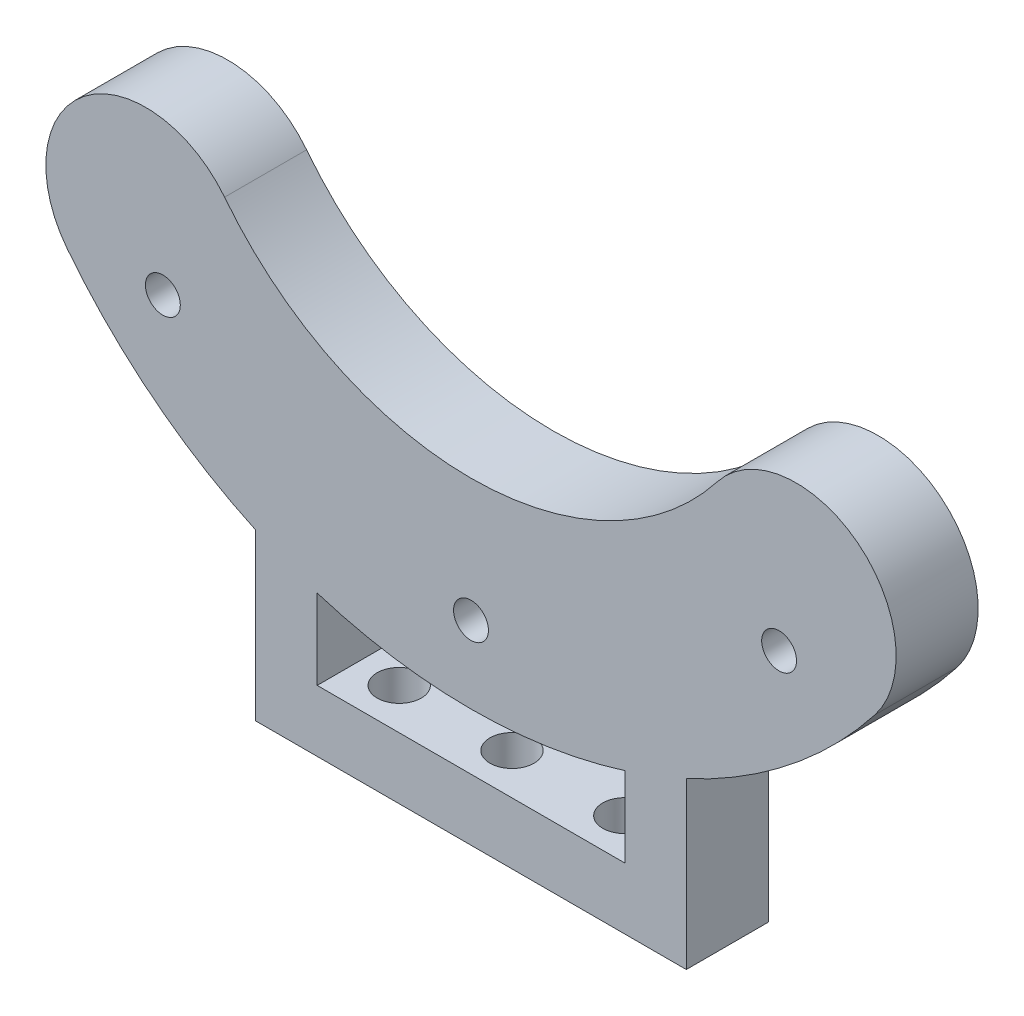
ISO-10303-21;
HEADER;
FILE_DESCRIPTION(('STEP AP214'),'2;1');
FILE_NAME('part.step','',(''),(''),'','','');
FILE_SCHEMA(('AUTOMOTIVE_DESIGN { 1 0 10303 214 1 1 1 1 }'));
ENDSEC;
DATA;
#1=APPLICATION_CONTEXT('core data for automotive mechanical design processes');
#2=APPLICATION_PROTOCOL_DEFINITION('international standard','automotive_design',2000,#1);
#3=PRODUCT_CONTEXT('',#1,'mechanical');
#4=PRODUCT('Part','Part','',(#3));
#5=PRODUCT_RELATED_PRODUCT_CATEGORY('part','',(#4));
#6=PRODUCT_DEFINITION_FORMATION('','',#4);
#7=PRODUCT_DEFINITION_CONTEXT('part definition',#1,'design');
#8=PRODUCT_DEFINITION('design','',#6,#7);
#9=PRODUCT_DEFINITION_SHAPE('','',#8);
#10=(LENGTH_UNIT() NAMED_UNIT(*) SI_UNIT(.MILLI.,.METRE.));
#11=(NAMED_UNIT(*) PLANE_ANGLE_UNIT() SI_UNIT($,.RADIAN.));
#12=(NAMED_UNIT(*) SI_UNIT($,.STERADIAN.) SOLID_ANGLE_UNIT());
#13=UNCERTAINTY_MEASURE_WITH_UNIT(LENGTH_MEASURE(1.E-05),#10,'distance_accuracy_value','');
#14=(GEOMETRIC_REPRESENTATION_CONTEXT(3) GLOBAL_UNCERTAINTY_ASSIGNED_CONTEXT((#13)) GLOBAL_UNIT_ASSIGNED_CONTEXT((#10,
#11,#12)) REPRESENTATION_CONTEXT('',''));
#15=CARTESIAN_POINT('',(0.,0.,0.));
#16=DIRECTION('',(0.,0.,1.));
#17=DIRECTION('',(1.,0.,0.));
#18=AXIS2_PLACEMENT_3D('',#15,#16,#17);
#19=CARTESIAN_POINT('',(0.,-61.5,0.));
#20=DIRECTION('',(0.,-1.,0.));
#21=DIRECTION('',(1.,0.,0.));
#22=AXIS2_PLACEMENT_3D('',#19,#20,#21);
#23=PLANE('',#22);
#24=CARTESIAN_POINT('',(11.,-61.5,4.00000000000001));
#25=DIRECTION('',(0.,1.,0.));
#26=DIRECTION('',(-1.,0.,0.));
#27=AXIS2_PLACEMENT_3D('',#24,#25,#26);
#28=CIRCLE('',#27,2.15);
#29=CARTESIAN_POINT('',(8.85000000000001,-61.5,4.00000000000001));
#30=VERTEX_POINT('',#29);
#31=EDGE_CURVE('E522',#30,#30,#28,.T.);
#32=ORIENTED_EDGE('',*,*,#31,.T.);
#33=EDGE_LOOP('',(#32));
#34=FACE_BOUND('',#33,.T.);
#35=DIRECTION('',(1.,0.,0.));
#36=VECTOR('',#35,1.);
#37=CARTESIAN_POINT('',(0.,-61.5,8.));
#38=LINE('',#37,#36);
#39=CARTESIAN_POINT('',(-21.,-61.5,8.));
#40=VERTEX_POINT('',#39);
#41=CARTESIAN_POINT('',(21.,-61.5,8.));
#42=VERTEX_POINT('',#41);
#43=EDGE_CURVE('E190',#40,#42,#38,.T.);
#44=ORIENTED_EDGE('',*,*,#43,.F.);
#45=DIRECTION('',(0.,0.,1.));
#46=VECTOR('',#45,1.);
#47=CARTESIAN_POINT('',(-21.,-61.5,0.));
#48=LINE('',#47,#46);
#49=CARTESIAN_POINT('',(-21.,-61.5,0.));
#50=VERTEX_POINT('',#49);
#51=EDGE_CURVE('E198',#50,#40,#48,.T.);
#52=ORIENTED_EDGE('',*,*,#51,.F.);
#53=DIRECTION('',(1.,0.,0.));
#54=VECTOR('',#53,1.);
#55=CARTESIAN_POINT('',(0.,-61.5,0.));
#56=LINE('',#55,#54);
#57=CARTESIAN_POINT('',(21.,-61.5,0.));
#58=VERTEX_POINT('',#57);
#59=EDGE_CURVE('E346',#50,#58,#56,.T.);
#60=ORIENTED_EDGE('',*,*,#59,.T.);
#61=DIRECTION('',(0.,0.,1.));
#62=VECTOR('',#61,1.);
#63=CARTESIAN_POINT('',(21.,-61.5,0.));
#64=LINE('',#63,#62);
#65=EDGE_CURVE('E196',#58,#42,#64,.T.);
#66=ORIENTED_EDGE('',*,*,#65,.T.);
#67=EDGE_LOOP('',(#44,#52,#60,#66));
#68=FACE_BOUND('',#67,.T.);
#69=CARTESIAN_POINT('',(0.,-61.5,4.));
#70=DIRECTION('',(0.,-1.,0.));
#71=DIRECTION('',(1.,0.,0.));
#72=AXIS2_PLACEMENT_3D('',#69,#70,#71);
#73=CIRCLE('',#72,2.15);
#74=CARTESIAN_POINT('',(2.15000000000001,-61.5,4.));
#75=VERTEX_POINT('',#74);
#76=EDGE_CURVE('E519',#75,#75,#73,.T.);
#77=ORIENTED_EDGE('',*,*,#76,.F.);
#78=EDGE_LOOP('',(#77));
#79=FACE_BOUND('',#78,.T.);
#80=CARTESIAN_POINT('',(-11.,-61.5,3.99999999999999));
#81=DIRECTION('',(0.,-1.,0.));
#82=DIRECTION('',(1.,0.,0.));
#83=AXIS2_PLACEMENT_3D('',#80,#81,#82);
#84=CIRCLE('',#83,2.15);
#85=CARTESIAN_POINT('',(-8.84999999999999,-61.5,3.99999999999999));
#86=VERTEX_POINT('',#85);
#87=EDGE_CURVE('E172',#86,#86,#84,.T.);
#88=ORIENTED_EDGE('',*,*,#87,.F.);
#89=EDGE_LOOP('',(#88));
#90=FACE_BOUND('',#89,.T.);
#91=ADVANCED_FACE('F40',(#34,#68,#79,#90),#23,.T.);
#92=CARTESIAN_POINT('',(0.,-55.5,0.));
#93=DIRECTION('',(0.,-1.,0.));
#94=DIRECTION('',(0.,0.,-1.));
#95=AXIS2_PLACEMENT_3D('',#92,#93,#94);
#96=PLANE('',#95);
#97=CARTESIAN_POINT('',(0.,-55.5,4.));
#98=DIRECTION('',(0.,-1.,0.));
#99=DIRECTION('',(0.,0.,-1.));
#100=AXIS2_PLACEMENT_3D('',#97,#98,#99);
#101=CIRCLE('',#100,2.15);
#102=CARTESIAN_POINT('',(0.,-55.5,1.85));
#103=VERTEX_POINT('',#102);
#104=EDGE_CURVE('E171',#103,#103,#101,.T.);
#105=ORIENTED_EDGE('',*,*,#104,.T.);
#106=EDGE_LOOP('',(#105));
#107=FACE_BOUND('',#106,.T.);
#108=CARTESIAN_POINT('',(11.,-55.5,4.00000000000001));
#109=DIRECTION('',(0.,-1.,0.));
#110=DIRECTION('',(0.,0.,-1.));
#111=AXIS2_PLACEMENT_3D('',#108,#109,#110);
#112=CIRCLE('',#111,2.15);
#113=CARTESIAN_POINT('',(11.,-55.5,1.85000000000002));
#114=VERTEX_POINT('',#113);
#115=EDGE_CURVE('E169',#114,#114,#112,.F.);
#116=ORIENTED_EDGE('',*,*,#115,.F.);
#117=EDGE_LOOP('',(#116));
#118=FACE_BOUND('',#117,.T.);
#119=DIRECTION('',(1.,0.,0.));
#120=VECTOR('',#119,1.);
#121=CARTESIAN_POINT('',(0.,-55.5,8.));
#122=LINE('',#121,#120);
#123=CARTESIAN_POINT('',(-15.,-55.5,8.));
#124=VERTEX_POINT('',#123);
#125=CARTESIAN_POINT('',(15.,-55.5,8.));
#126=VERTEX_POINT('',#125);
#127=EDGE_CURVE('E179',#124,#126,#122,.T.);
#128=ORIENTED_EDGE('',*,*,#127,.T.);
#129=DIRECTION('',(0.,0.,1.));
#130=VECTOR('',#129,1.);
#131=CARTESIAN_POINT('',(15.,-55.5,0.));
#132=LINE('',#131,#130);
#133=CARTESIAN_POINT('',(15.,-55.5,0.));
#134=VERTEX_POINT('',#133);
#135=EDGE_CURVE('E141',#134,#126,#132,.T.);
#136=ORIENTED_EDGE('',*,*,#135,.F.);
#137=DIRECTION('',(1.,0.,0.));
#138=VECTOR('',#137,1.);
#139=CARTESIAN_POINT('',(0.,-55.5,0.));
#140=LINE('',#139,#138);
#141=CARTESIAN_POINT('',(-15.,-55.5,0.));
#142=VERTEX_POINT('',#141);
#143=EDGE_CURVE('E150',#142,#134,#140,.T.);
#144=ORIENTED_EDGE('',*,*,#143,.F.);
#145=DIRECTION('',(0.,0.,1.));
#146=VECTOR('',#145,1.);
#147=CARTESIAN_POINT('',(-15.,-55.5,0.));
#148=LINE('',#147,#146);
#149=EDGE_CURVE('E204',#142,#124,#148,.T.);
#150=ORIENTED_EDGE('',*,*,#149,.T.);
#151=EDGE_LOOP('',(#128,#136,#144,#150));
#152=FACE_BOUND('',#151,.T.);
#153=CARTESIAN_POINT('',(-11.,-55.5,3.99999999999999));
#154=DIRECTION('',(0.,-1.,0.));
#155=DIRECTION('',(0.,0.,-1.));
#156=AXIS2_PLACEMENT_3D('',#153,#154,#155);
#157=CIRCLE('',#156,2.15);
#158=CARTESIAN_POINT('',(-11.,-55.5,1.85));
#159=VERTEX_POINT('',#158);
#160=EDGE_CURVE('E44',#159,#159,#157,.T.);
#161=ORIENTED_EDGE('',*,*,#160,.T.);
#162=EDGE_LOOP('',(#161));
#163=FACE_BOUND('',#162,.T.);
#164=ADVANCED_FACE('F264',(#107,#118,#152,#163),#96,.F.);
#165=CARTESIAN_POINT('',(0.,0.,8.));
#166=DIRECTION('',(0.,0.,-1.));
#167=DIRECTION('',(-1.,0.,0.));
#168=AXIS2_PLACEMENT_3D('',#165,#166,#167);
#169=CYLINDRICAL_SURFACE('',#168,50.);
#170=DIRECTION('',(0.,0.,1.));
#171=VECTOR('',#170,1.);
#172=CARTESIAN_POINT('',(21.,-45.3762052181537,0.));
#173=LINE('',#172,#171);
#174=CARTESIAN_POINT('',(21.,-45.3762052181537,0.));
#175=VERTEX_POINT('',#174);
#176=CARTESIAN_POINT('',(21.,-45.3762052181537,8.));
#177=VERTEX_POINT('',#176);
#178=EDGE_CURVE('E57',#175,#177,#173,.T.);
#179=ORIENTED_EDGE('',*,*,#178,.F.);
#180=CARTESIAN_POINT('',(0.,0.,0.));
#181=DIRECTION('',(0.,0.,1.));
#182=DIRECTION('',(1.,0.,0.));
#183=AXIS2_PLACEMENT_3D('',#180,#181,#182);
#184=CIRCLE('',#183,50.);
#185=CARTESIAN_POINT('',(39.4005376803363,-30.7830737662827,0.));
#186=VERTEX_POINT('',#185);
#187=EDGE_CURVE('E158',#175,#186,#184,.T.);
#188=ORIENTED_EDGE('',*,*,#187,.T.);
#189=DIRECTION('',(0.,0.,1.));
#190=VECTOR('',#189,1.);
#191=CARTESIAN_POINT('',(39.4005376803363,-30.7830737662827,-76.));
#192=LINE('',#191,#190);
#193=CARTESIAN_POINT('',(39.4005376803363,-30.7830737662827,8.));
#194=VERTEX_POINT('',#193);
#195=EDGE_CURVE('E213',#186,#194,#192,.T.);
#196=ORIENTED_EDGE('',*,*,#195,.T.);
#197=CARTESIAN_POINT('',(0.,0.,8.));
#198=DIRECTION('',(0.,0.,1.));
#199=DIRECTION('',(1.,0.,0.));
#200=AXIS2_PLACEMENT_3D('',#197,#198,#199);
#201=CIRCLE('',#200,50.);
#202=EDGE_CURVE('E161',#177,#194,#201,.T.);
#203=ORIENTED_EDGE('',*,*,#202,.F.);
#204=EDGE_LOOP('',(#179,#188,#196,#203));
#205=FACE_BOUND('',#204,.T.);
#206=ADVANCED_FACE('F261',(#205),#169,.T.);
#207=DIRECTION('',(0.,0.,1.));
#208=VECTOR('',#207,1.);
#209=CARTESIAN_POINT('',(-15.,-47.6969600708473,0.));
#210=LINE('',#209,#208);
#211=CARTESIAN_POINT('',(-15.,-47.6969600708473,0.));
#212=VERTEX_POINT('',#211);
#213=CARTESIAN_POINT('',(-15.,-47.6969600708473,8.));
#214=VERTEX_POINT('',#213);
#215=EDGE_CURVE('E156',#212,#214,#210,.T.);
#216=ORIENTED_EDGE('',*,*,#215,.F.);
#217=CARTESIAN_POINT('',(15.,-47.6969600708473,0.));
#218=VERTEX_POINT('',#217);
#219=EDGE_CURVE('E148',#212,#218,#184,.T.);
#220=ORIENTED_EDGE('',*,*,#219,.T.);
#221=DIRECTION('',(0.,0.,1.));
#222=VECTOR('',#221,1.);
#223=CARTESIAN_POINT('',(15.,-47.6969600708473,0.));
#224=LINE('',#223,#222);
#225=CARTESIAN_POINT('',(15.,-47.6969600708473,8.));
#226=VERTEX_POINT('',#225);
#227=EDGE_CURVE('E132',#218,#226,#224,.T.);
#228=ORIENTED_EDGE('',*,*,#227,.T.);
#229=EDGE_CURVE('E328',#214,#226,#201,.T.);
#230=ORIENTED_EDGE('',*,*,#229,.F.);
#231=EDGE_LOOP('',(#216,#220,#228,#230));
#232=FACE_BOUND('',#231,.T.);
#233=ADVANCED_FACE('F155',(#232),#169,.T.);
#234=CARTESIAN_POINT('',(0.,0.,8.));
#235=DIRECTION('',(0.,0.,1.));
#236=DIRECTION('',(1.,0.,0.));
#237=AXIS2_PLACEMENT_3D('',#234,#235,#236);
#238=PLANE('',#237);
#239=DIRECTION('',(0.,-1.,0.));
#240=VECTOR('',#239,1.);
#241=CARTESIAN_POINT('',(-15.,0.,8.));
#242=LINE('',#241,#240);
#243=EDGE_CURVE('E65',#214,#124,#242,.T.);
#244=ORIENTED_EDGE('',*,*,#243,.F.);
#245=ORIENTED_EDGE('',*,*,#229,.T.);
#246=DIRECTION('',(0.,-1.,0.));
#247=VECTOR('',#246,1.);
#248=CARTESIAN_POINT('',(15.,0.,8.));
#249=LINE('',#248,#247);
#250=EDGE_CURVE('E137',#226,#126,#249,.T.);
#251=ORIENTED_EDGE('',*,*,#250,.T.);
#252=ORIENTED_EDGE('',*,*,#127,.F.);
#253=EDGE_LOOP('',(#244,#245,#251,#252));
#254=FACE_BOUND('',#253,.T.);
#255=CARTESIAN_POINT('',(-30.0520382004285,-30.052038200428,8.));
#256=DIRECTION('',(0.,0.,1.));
#257=DIRECTION('',(1.,0.,0.));
#258=AXIS2_PLACEMENT_3D('',#255,#256,#257);
#259=CIRCLE('',#258,1.7);
#260=CARTESIAN_POINT('',(-28.3520382004285,-30.052038200428,8.));
#261=VERTEX_POINT('',#260);
#262=EDGE_CURVE('E229',#261,#261,#259,.T.);
#263=ORIENTED_EDGE('',*,*,#262,.F.);
#264=EDGE_LOOP('',(#263));
#265=FACE_BOUND('',#264,.T.);
#266=CARTESIAN_POINT('',(30.0520382004281,-30.0520382004284,8.));
#267=DIRECTION('',(0.,0.,1.));
#268=DIRECTION('',(1.,0.,0.));
#269=AXIS2_PLACEMENT_3D('',#266,#267,#268);
#270=CIRCLE('',#269,1.7);
#271=CARTESIAN_POINT('',(31.7520382004281,-30.0520382004284,8.));
#272=VERTEX_POINT('',#271);
#273=EDGE_CURVE('E162',#272,#272,#270,.T.);
#274=ORIENTED_EDGE('',*,*,#273,.F.);
#275=EDGE_LOOP('',(#274));
#276=FACE_BOUND('',#275,.T.);
#277=CARTESIAN_POINT('',(-2.96775913801666E-13,-42.5,8.));
#278=DIRECTION('',(0.,0.,1.));
#279=DIRECTION('',(1.,0.,0.));
#280=AXIS2_PLACEMENT_3D('',#277,#278,#279);
#281=CIRCLE('',#280,1.7);
#282=CARTESIAN_POINT('',(1.6999999999997,-42.5,8.));
#283=VERTEX_POINT('',#282);
#284=EDGE_CURVE('E235',#283,#283,#281,.T.);
#285=ORIENTED_EDGE('',*,*,#284,.F.);
#286=EDGE_LOOP('',(#285));
#287=FACE_BOUND('',#286,.T.);
#288=CARTESIAN_POINT('',(-39.4005376803363,-30.7830737662827,8.));
#289=VERTEX_POINT('',#288);
#290=CARTESIAN_POINT('',(-21.,-45.3762052181537,8.));
#291=VERTEX_POINT('',#290);
#292=EDGE_CURVE('E165',#289,#291,#201,.T.);
#293=ORIENTED_EDGE('',*,*,#292,.T.);
#294=DIRECTION('',(0.,-1.,0.));
#295=VECTOR('',#294,1.);
#296=CARTESIAN_POINT('',(-21.,0.,8.));
#297=LINE('',#296,#295);
#298=EDGE_CURVE('E187',#291,#40,#297,.T.);
#299=ORIENTED_EDGE('',*,*,#298,.T.);
#300=ORIENTED_EDGE('',*,*,#43,.T.);
#301=DIRECTION('',(0.,-1.,0.));
#302=VECTOR('',#301,1.);
#303=CARTESIAN_POINT('',(21.,0.,8.));
#304=LINE('',#303,#302);
#305=EDGE_CURVE('E152',#177,#42,#304,.T.);
#306=ORIENTED_EDGE('',*,*,#305,.F.);
#307=ORIENTED_EDGE('',*,*,#202,.T.);
#308=CARTESIAN_POINT('',(31.7174328326707,-24.7803743818576,8.));
#309=DIRECTION('',(0.,0.,1.));
#310=DIRECTION('',(1.,0.,0.));
#311=AXIS2_PLACEMENT_3D('',#308,#309,#310);
#312=CIRCLE('',#311,9.75);
#313=CARTESIAN_POINT('',(24.0343279850051,-18.7776749974324,8.));
#314=VERTEX_POINT('',#313);
#315=EDGE_CURVE('E209',#194,#314,#312,.T.);
#316=ORIENTED_EDGE('',*,*,#315,.T.);
#317=CARTESIAN_POINT('',(0.,0.,8.));
#318=DIRECTION('',(0.,0.,1.));
#319=DIRECTION('',(1.,0.,0.));
#320=AXIS2_PLACEMENT_3D('',#317,#318,#319);
#321=CIRCLE('',#320,30.5);
#322=CARTESIAN_POINT('',(-24.0343279850051,-18.7776749974324,8.));
#323=VERTEX_POINT('',#322);
#324=EDGE_CURVE('E222',#323,#314,#321,.T.);
#325=ORIENTED_EDGE('',*,*,#324,.F.);
#326=CARTESIAN_POINT('',(-31.7174328326707,-24.7803743818576,8.));
#327=DIRECTION('',(0.,0.,1.));
#328=DIRECTION('',(1.,0.,0.));
#329=AXIS2_PLACEMENT_3D('',#326,#327,#328);
#330=CIRCLE('',#329,9.75);
#331=EDGE_CURVE('E195',#289,#323,#330,.F.);
#332=ORIENTED_EDGE('',*,*,#331,.F.);
#333=EDGE_LOOP('',(#293,#299,#300,#306,#307,#316,#325,#332));
#334=FACE_BOUND('',#333,.T.);
#335=ADVANCED_FACE('F308',(#254,#265,#276,#287,#334),#238,.T.);
#336=CARTESIAN_POINT('',(0.,0.,0.));
#337=DIRECTION('',(0.,0.,1.));
#338=DIRECTION('',(1.,0.,0.));
#339=AXIS2_PLACEMENT_3D('',#336,#337,#338);
#340=PLANE('',#339);
#341=ORIENTED_EDGE('',*,*,#219,.F.);
#342=DIRECTION('',(0.,-1.,0.));
#343=VECTOR('',#342,1.);
#344=CARTESIAN_POINT('',(-15.,0.,0.));
#345=LINE('',#344,#343);
#346=EDGE_CURVE('E527',#212,#142,#345,.T.);
#347=ORIENTED_EDGE('',*,*,#346,.T.);
#348=ORIENTED_EDGE('',*,*,#143,.T.);
#349=DIRECTION('',(0.,-1.,0.));
#350=VECTOR('',#349,1.);
#351=CARTESIAN_POINT('',(15.,0.,0.));
#352=LINE('',#351,#350);
#353=EDGE_CURVE('E135',#218,#134,#352,.T.);
#354=ORIENTED_EDGE('',*,*,#353,.F.);
#355=EDGE_LOOP('',(#341,#347,#348,#354));
#356=FACE_BOUND('',#355,.T.);
#357=CARTESIAN_POINT('',(-30.0520382004285,-30.052038200428,0.));
#358=DIRECTION('',(0.,0.,1.));
#359=DIRECTION('',(1.,0.,0.));
#360=AXIS2_PLACEMENT_3D('',#357,#358,#359);
#361=CIRCLE('',#360,1.7);
#362=CARTESIAN_POINT('',(-28.3520382004285,-30.052038200428,0.));
#363=VERTEX_POINT('',#362);
#364=EDGE_CURVE('E226',#363,#363,#361,.T.);
#365=ORIENTED_EDGE('',*,*,#364,.T.);
#366=EDGE_LOOP('',(#365));
#367=FACE_BOUND('',#366,.T.);
#368=CARTESIAN_POINT('',(-2.96775913801666E-13,-42.5,0.));
#369=DIRECTION('',(0.,0.,1.));
#370=DIRECTION('',(1.,0.,0.));
#371=AXIS2_PLACEMENT_3D('',#368,#369,#370);
#372=CIRCLE('',#371,1.7);
#373=CARTESIAN_POINT('',(1.6999999999997,-42.5,0.));
#374=VERTEX_POINT('',#373);
#375=EDGE_CURVE('E232',#374,#374,#372,.T.);
#376=ORIENTED_EDGE('',*,*,#375,.T.);
#377=EDGE_LOOP('',(#376));
#378=FACE_BOUND('',#377,.T.);
#379=CARTESIAN_POINT('',(30.0520382004281,-30.0520382004284,0.));
#380=DIRECTION('',(0.,0.,1.));
#381=DIRECTION('',(1.,0.,0.));
#382=AXIS2_PLACEMENT_3D('',#379,#380,#381);
#383=CIRCLE('',#382,1.7);
#384=CARTESIAN_POINT('',(31.7520382004281,-30.0520382004284,0.));
#385=VERTEX_POINT('',#384);
#386=EDGE_CURVE('E238',#385,#385,#383,.T.);
#387=ORIENTED_EDGE('',*,*,#386,.T.);
#388=EDGE_LOOP('',(#387));
#389=FACE_BOUND('',#388,.T.);
#390=CARTESIAN_POINT('',(31.7174328326707,-24.7803743818576,0.));
#391=DIRECTION('',(0.,0.,1.));
#392=DIRECTION('',(1.,0.,0.));
#393=AXIS2_PLACEMENT_3D('',#390,#391,#392);
#394=CIRCLE('',#393,9.75);
#395=CARTESIAN_POINT('',(24.0343279850051,-18.7776749974324,0.));
#396=VERTEX_POINT('',#395);
#397=EDGE_CURVE('E220',#186,#396,#394,.T.);
#398=ORIENTED_EDGE('',*,*,#397,.F.);
#399=ORIENTED_EDGE('',*,*,#187,.F.);
#400=DIRECTION('',(0.,-1.,0.));
#401=VECTOR('',#400,1.);
#402=CARTESIAN_POINT('',(21.,0.,0.));
#403=LINE('',#402,#401);
#404=EDGE_CURVE('E142',#175,#58,#403,.T.);
#405=ORIENTED_EDGE('',*,*,#404,.T.);
#406=ORIENTED_EDGE('',*,*,#59,.F.);
#407=DIRECTION('',(0.,-1.,0.));
#408=VECTOR('',#407,1.);
#409=CARTESIAN_POINT('',(-21.,0.,0.));
#410=LINE('',#409,#408);
#411=CARTESIAN_POINT('',(-21.,-45.3762052181537,0.));
#412=VERTEX_POINT('',#411);
#413=EDGE_CURVE('E342',#412,#50,#410,.T.);
#414=ORIENTED_EDGE('',*,*,#413,.F.);
#415=CARTESIAN_POINT('',(-39.4005376803363,-30.7830737662827,0.));
#416=VERTEX_POINT('',#415);
#417=EDGE_CURVE('E157',#416,#412,#184,.T.);
#418=ORIENTED_EDGE('',*,*,#417,.F.);
#419=CARTESIAN_POINT('',(-31.7174328326707,-24.7803743818576,0.));
#420=DIRECTION('',(0.,0.,1.));
#421=DIRECTION('',(1.,0.,0.));
#422=AXIS2_PLACEMENT_3D('',#419,#420,#421);
#423=CIRCLE('',#422,9.75);
#424=CARTESIAN_POINT('',(-24.0343279850051,-18.7776749974324,0.));
#425=VERTEX_POINT('',#424);
#426=EDGE_CURVE('E216',#416,#425,#423,.F.);
#427=ORIENTED_EDGE('',*,*,#426,.T.);
#428=CARTESIAN_POINT('',(0.,0.,0.));
#429=DIRECTION('',(0.,0.,1.));
#430=DIRECTION('',(1.,0.,0.));
#431=AXIS2_PLACEMENT_3D('',#428,#429,#430);
#432=CIRCLE('',#431,30.5);
#433=EDGE_CURVE('E223',#425,#396,#432,.T.);
#434=ORIENTED_EDGE('',*,*,#433,.T.);
#435=EDGE_LOOP('',(#398,#399,#405,#406,#414,#418,#427,#434));
#436=FACE_BOUND('',#435,.T.);
#437=ADVANCED_FACE('F146',(#356,#367,#378,#389,#436),#340,.F.);
#438=CARTESIAN_POINT('',(0.,0.,0.));
#439=DIRECTION('',(0.,0.,1.));
#440=DIRECTION('',(1.,0.,0.));
#441=AXIS2_PLACEMENT_3D('',#438,#439,#440);
#442=CYLINDRICAL_SURFACE('',#441,30.5);
#443=DIRECTION('',(0.,0.,1.));
#444=VECTOR('',#443,1.);
#445=CARTESIAN_POINT('',(24.0343279850051,-18.7776749974324,-34.));
#446=LINE('',#445,#444);
#447=EDGE_CURVE('E11',#396,#314,#446,.T.);
#448=ORIENTED_EDGE('',*,*,#447,.F.);
#449=ORIENTED_EDGE('',*,*,#433,.F.);
#450=DIRECTION('',(0.,0.,1.));
#451=VECTOR('',#450,1.);
#452=CARTESIAN_POINT('',(-24.0343279850051,-18.7776749974324,-34.));
#453=LINE('',#452,#451);
#454=EDGE_CURVE('E49',#425,#323,#453,.T.);
#455=ORIENTED_EDGE('',*,*,#454,.T.);
#456=ORIENTED_EDGE('',*,*,#324,.T.);
#457=EDGE_LOOP('',(#448,#449,#455,#456));
#458=FACE_BOUND('',#457,.T.);
#459=ADVANCED_FACE('F259',(#458),#442,.F.);
#460=ORIENTED_EDGE('',*,*,#417,.T.);
#461=DIRECTION('',(0.,0.,1.));
#462=VECTOR('',#461,1.);
#463=CARTESIAN_POINT('',(-21.,-45.3762052181537,0.));
#464=LINE('',#463,#462);
#465=EDGE_CURVE('E200',#412,#291,#464,.T.);
#466=ORIENTED_EDGE('',*,*,#465,.T.);
#467=ORIENTED_EDGE('',*,*,#292,.F.);
#468=DIRECTION('',(0.,0.,1.));
#469=VECTOR('',#468,1.);
#470=CARTESIAN_POINT('',(-39.4005376803363,-30.7830737662827,-76.));
#471=LINE('',#470,#469);
#472=EDGE_CURVE('E212',#416,#289,#471,.T.);
#473=ORIENTED_EDGE('',*,*,#472,.F.);
#474=EDGE_LOOP('',(#460,#466,#467,#473));
#475=FACE_BOUND('',#474,.T.);
#476=ADVANCED_FACE('F42',(#475),#169,.T.);
#477=CARTESIAN_POINT('',(30.0520382004281,-30.0520382004284,8.));
#478=DIRECTION('',(0.,0.,-1.));
#479=DIRECTION('',(-1.,0.,0.));
#480=AXIS2_PLACEMENT_3D('',#477,#478,#479);
#481=CYLINDRICAL_SURFACE('',#480,1.7);
#482=ORIENTED_EDGE('',*,*,#273,.T.);
#483=EDGE_LOOP('',(#482));
#484=FACE_BOUND('',#483,.T.);
#485=ORIENTED_EDGE('',*,*,#386,.F.);
#486=EDGE_LOOP('',(#485));
#487=FACE_BOUND('',#486,.T.);
#488=ADVANCED_FACE('F247',(#484,#487),#481,.F.);
#489=CARTESIAN_POINT('',(-2.96775913801666E-13,-42.5,8.));
#490=DIRECTION('',(0.,0.,-1.));
#491=DIRECTION('',(-1.,0.,0.));
#492=AXIS2_PLACEMENT_3D('',#489,#490,#491);
#493=CYLINDRICAL_SURFACE('',#492,1.7);
#494=ORIENTED_EDGE('',*,*,#284,.T.);
#495=EDGE_LOOP('',(#494));
#496=FACE_BOUND('',#495,.T.);
#497=ORIENTED_EDGE('',*,*,#375,.F.);
#498=EDGE_LOOP('',(#497));
#499=FACE_BOUND('',#498,.T.);
#500=ADVANCED_FACE('F249',(#496,#499),#493,.F.);
#501=CARTESIAN_POINT('',(-30.0520382004285,-30.052038200428,8.));
#502=DIRECTION('',(0.,0.,-1.));
#503=DIRECTION('',(-1.,0.,0.));
#504=AXIS2_PLACEMENT_3D('',#501,#502,#503);
#505=CYLINDRICAL_SURFACE('',#504,1.7);
#506=ORIENTED_EDGE('',*,*,#262,.T.);
#507=EDGE_LOOP('',(#506));
#508=FACE_BOUND('',#507,.T.);
#509=ORIENTED_EDGE('',*,*,#364,.F.);
#510=EDGE_LOOP('',(#509));
#511=FACE_BOUND('',#510,.T.);
#512=ADVANCED_FACE('F256',(#508,#511),#505,.F.);
#513=CARTESIAN_POINT('',(-31.7174328326707,-24.7803743818576,-76.));
#514=DIRECTION('',(0.,0.,1.));
#515=DIRECTION('',(1.,0.,0.));
#516=AXIS2_PLACEMENT_3D('',#513,#514,#515);
#517=CYLINDRICAL_SURFACE('',#516,9.75);
#518=ORIENTED_EDGE('',*,*,#472,.T.);
#519=ORIENTED_EDGE('',*,*,#331,.T.);
#520=ORIENTED_EDGE('',*,*,#454,.F.);
#521=ORIENTED_EDGE('',*,*,#426,.F.);
#522=EDGE_LOOP('',(#518,#519,#520,#521));
#523=FACE_BOUND('',#522,.T.);
#524=ADVANCED_FACE('F291',(#523),#517,.T.);
#525=CARTESIAN_POINT('',(31.7174328326707,-24.7803743818576,-76.));
#526=DIRECTION('',(0.,0.,1.));
#527=DIRECTION('',(1.,0.,0.));
#528=AXIS2_PLACEMENT_3D('',#525,#526,#527);
#529=CYLINDRICAL_SURFACE('',#528,9.75);
#530=ORIENTED_EDGE('',*,*,#397,.T.);
#531=ORIENTED_EDGE('',*,*,#447,.T.);
#532=ORIENTED_EDGE('',*,*,#315,.F.);
#533=ORIENTED_EDGE('',*,*,#195,.F.);
#534=EDGE_LOOP('',(#530,#531,#532,#533));
#535=FACE_BOUND('',#534,.T.);
#536=ADVANCED_FACE('F288',(#535),#529,.T.);
#537=CARTESIAN_POINT('',(21.,0.,0.));
#538=DIRECTION('',(-1.,0.,0.));
#539=DIRECTION('',(0.,-1.,0.));
#540=AXIS2_PLACEMENT_3D('',#537,#538,#539);
#541=PLANE('',#540);
#542=ORIENTED_EDGE('',*,*,#305,.T.);
#543=ORIENTED_EDGE('',*,*,#65,.F.);
#544=ORIENTED_EDGE('',*,*,#404,.F.);
#545=ORIENTED_EDGE('',*,*,#178,.T.);
#546=EDGE_LOOP('',(#542,#543,#544,#545));
#547=FACE_BOUND('',#546,.T.);
#548=ADVANCED_FACE('F275',(#547),#541,.F.);
#549=CARTESIAN_POINT('',(-21.,0.,0.));
#550=DIRECTION('',(-1.,0.,0.));
#551=DIRECTION('',(0.,-1.,0.));
#552=AXIS2_PLACEMENT_3D('',#549,#550,#551);
#553=PLANE('',#552);
#554=ORIENTED_EDGE('',*,*,#298,.F.);
#555=ORIENTED_EDGE('',*,*,#465,.F.);
#556=ORIENTED_EDGE('',*,*,#413,.T.);
#557=ORIENTED_EDGE('',*,*,#51,.T.);
#558=EDGE_LOOP('',(#554,#555,#556,#557));
#559=FACE_BOUND('',#558,.T.);
#560=ADVANCED_FACE('F277',(#559),#553,.T.);
#561=CARTESIAN_POINT('',(-15.,0.,0.));
#562=DIRECTION('',(-1.,0.,0.));
#563=DIRECTION('',(0.,-1.,0.));
#564=AXIS2_PLACEMENT_3D('',#561,#562,#563);
#565=PLANE('',#564);
#566=ORIENTED_EDGE('',*,*,#243,.T.);
#567=ORIENTED_EDGE('',*,*,#149,.F.);
#568=ORIENTED_EDGE('',*,*,#346,.F.);
#569=ORIENTED_EDGE('',*,*,#215,.T.);
#570=EDGE_LOOP('',(#566,#567,#568,#569));
#571=FACE_BOUND('',#570,.T.);
#572=ADVANCED_FACE('F280',(#571),#565,.F.);
#573=CARTESIAN_POINT('',(15.,0.,0.));
#574=DIRECTION('',(-1.,0.,0.));
#575=DIRECTION('',(0.,-1.,0.));
#576=AXIS2_PLACEMENT_3D('',#573,#574,#575);
#577=PLANE('',#576);
#578=ORIENTED_EDGE('',*,*,#250,.F.);
#579=ORIENTED_EDGE('',*,*,#227,.F.);
#580=ORIENTED_EDGE('',*,*,#353,.T.);
#581=ORIENTED_EDGE('',*,*,#135,.T.);
#582=EDGE_LOOP('',(#578,#579,#580,#581));
#583=FACE_BOUND('',#582,.T.);
#584=ADVANCED_FACE('F134',(#583),#577,.T.);
#585=CARTESIAN_POINT('',(11.,-53.5,4.00000000000001));
#586=DIRECTION('',(0.,-1.,0.));
#587=DIRECTION('',(1.,0.,0.));
#588=AXIS2_PLACEMENT_3D('',#585,#586,#587);
#589=CYLINDRICAL_SURFACE('',#588,2.15);
#590=ORIENTED_EDGE('',*,*,#31,.F.);
#591=EDGE_LOOP('',(#590));
#592=FACE_BOUND('',#591,.T.);
#593=ORIENTED_EDGE('',*,*,#115,.T.);
#594=EDGE_LOOP('',(#593));
#595=FACE_BOUND('',#594,.T.);
#596=ADVANCED_FACE('F287',(#592,#595),#589,.F.);
#597=CARTESIAN_POINT('',(0.,-53.5,4.));
#598=DIRECTION('',(0.,-1.,0.));
#599=DIRECTION('',(1.,0.,0.));
#600=AXIS2_PLACEMENT_3D('',#597,#598,#599);
#601=CYLINDRICAL_SURFACE('',#600,2.15);
#602=ORIENTED_EDGE('',*,*,#76,.T.);
#603=EDGE_LOOP('',(#602));
#604=FACE_BOUND('',#603,.T.);
#605=ORIENTED_EDGE('',*,*,#104,.F.);
#606=EDGE_LOOP('',(#605));
#607=FACE_BOUND('',#606,.T.);
#608=ADVANCED_FACE('F371',(#604,#607),#601,.F.);
#609=CARTESIAN_POINT('',(-11.,-53.5,3.99999999999999));
#610=DIRECTION('',(0.,-1.,0.));
#611=DIRECTION('',(1.,0.,0.));
#612=AXIS2_PLACEMENT_3D('',#609,#610,#611);
#613=CYLINDRICAL_SURFACE('',#612,2.15);
#614=ORIENTED_EDGE('',*,*,#87,.T.);
#615=EDGE_LOOP('',(#614));
#616=FACE_BOUND('',#615,.T.);
#617=ORIENTED_EDGE('',*,*,#160,.F.);
#618=EDGE_LOOP('',(#617));
#619=FACE_BOUND('',#618,.T.);
#620=ADVANCED_FACE('F379',(#616,#619),#613,.F.);
#621=CLOSED_SHELL('',(#91,#164,#206,#233,#335,#437,#459,#476,#488,#500,#512,#524,#536,#548,#560,
#572,#584,#596,#608,#620));
#622=MANIFOLD_SOLID_BREP('B2',#621);
#623=ADVANCED_BREP_SHAPE_REPRESENTATION('',(#18,#622),#14);
#624=SHAPE_DEFINITION_REPRESENTATION(#9,#623);
ENDSEC;
END-ISO-10303-21;
